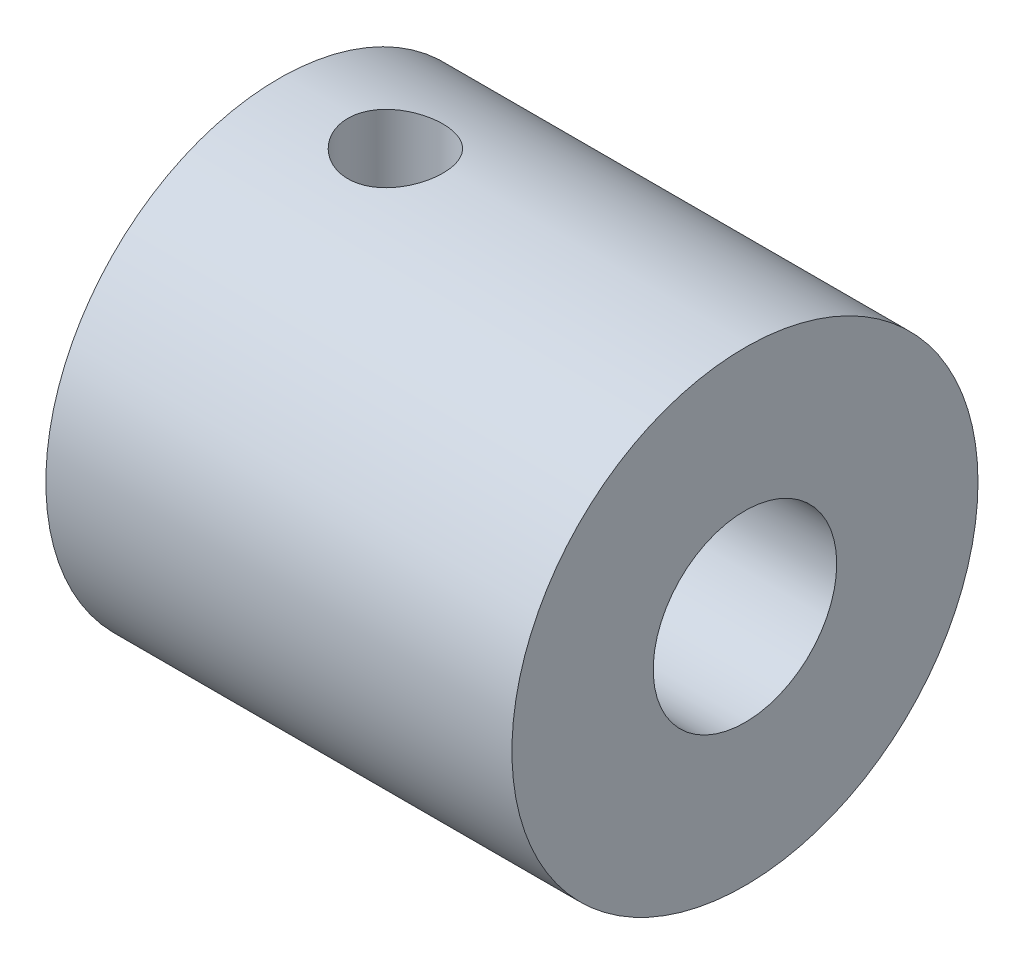
ISO-10303-21;
HEADER;
FILE_DESCRIPTION(('STEP AP214'),'2;1');
FILE_NAME('part.step','',(''),(''),'','','');
FILE_SCHEMA(('AUTOMOTIVE_DESIGN { 1 0 10303 214 1 1 1 1 }'));
ENDSEC;
DATA;
#1=APPLICATION_CONTEXT('core data for automotive mechanical design processes');
#2=APPLICATION_PROTOCOL_DEFINITION('international standard','automotive_design',2000,#1);
#3=PRODUCT_CONTEXT('',#1,'mechanical');
#4=PRODUCT('Part','Part','',(#3));
#5=PRODUCT_RELATED_PRODUCT_CATEGORY('part','',(#4));
#6=PRODUCT_DEFINITION_FORMATION('','',#4);
#7=PRODUCT_DEFINITION_CONTEXT('part definition',#1,'design');
#8=PRODUCT_DEFINITION('design','',#6,#7);
#9=PRODUCT_DEFINITION_SHAPE('','',#8);
#10=(LENGTH_UNIT() NAMED_UNIT(*) SI_UNIT(.MILLI.,.METRE.));
#11=(NAMED_UNIT(*) PLANE_ANGLE_UNIT() SI_UNIT($,.RADIAN.));
#12=(NAMED_UNIT(*) SI_UNIT($,.STERADIAN.) SOLID_ANGLE_UNIT());
#13=UNCERTAINTY_MEASURE_WITH_UNIT(LENGTH_MEASURE(1.E-05),#10,'distance_accuracy_value','');
#14=(GEOMETRIC_REPRESENTATION_CONTEXT(3) GLOBAL_UNCERTAINTY_ASSIGNED_CONTEXT((#13)) GLOBAL_UNIT_ASSIGNED_CONTEXT((#10,
#11,#12)) REPRESENTATION_CONTEXT('',''));
#15=CARTESIAN_POINT('',(0.,0.,0.));
#16=DIRECTION('',(0.,0.,1.));
#17=DIRECTION('',(1.,0.,0.));
#18=AXIS2_PLACEMENT_3D('',#15,#16,#17);
#19=CARTESIAN_POINT('',(25.4,0.,0.));
#20=DIRECTION('',(-1.,0.,0.));
#21=DIRECTION('',(0.,0.,1.));
#22=AXIS2_PLACEMENT_3D('',#19,#20,#21);
#23=CYLINDRICAL_SURFACE('',#22,12.7);
#24=CARTESIAN_POINT('',(6.35,12.4329302805091,-2.5908));
#25=CARTESIAN_POINT('',(6.49389236460437,12.4329331586559,-2.59079475206476));
#26=CARTESIAN_POINT('',(6.63785018657695,12.4354554548789,-2.57877165643568));
#27=CARTESIAN_POINT('',(6.92168894069004,12.4452565300148,-2.5310396013166));
#28=CARTESIAN_POINT('',(7.06156658598013,12.4525390387619,-2.49531206803491));
#29=CARTESIAN_POINT('',(7.33309763450372,12.4710022077238,-2.40132879766478));
#30=CARTESIAN_POINT('',(7.46475923410862,12.4821789073253,-2.34309594321986));
#31=CARTESIAN_POINT('',(7.7164416251351,12.5071664052162,-2.20581830696668));
#32=CARTESIAN_POINT('',(7.83646298050038,12.5209770757993,-2.12677453409063));
#33=CARTESIAN_POINT('',(8.06322853867538,12.5499033343607,-1.94887955710783));
#34=CARTESIAN_POINT('',(8.16977661170327,12.5650337385242,-1.8497807118404));
#35=CARTESIAN_POINT('',(8.36485772289805,12.5947643911458,-1.63512360250815));
#36=CARTESIAN_POINT('',(8.45338947070995,12.6093646015692,-1.51956416051877));
#37=CARTESIAN_POINT('',(8.61068896930447,12.6365499435243,-1.27396400187411));
#38=CARTESIAN_POINT('',(8.67926986862163,12.6491155642424,-1.14380126752145));
#39=CARTESIAN_POINT('',(8.79351454054484,12.6706492937657,-0.873500778455588));
#40=CARTESIAN_POINT('',(8.83918054581728,12.6796177530359,-0.733363997063294));
#41=CARTESIAN_POINT('',(8.90568728002511,12.6928419786629,-0.449129652825707));
#42=CARTESIAN_POINT('',(8.92685936115953,12.6971605909399,-0.305112594403049));
#43=CARTESIAN_POINT('',(8.94481150712322,12.7008157262987,-0.0155102229442602));
#44=CARTESIAN_POINT('',(8.94159401333011,12.7001527480339,0.130074931669876));
#45=CARTESIAN_POINT('',(8.91110872531533,12.6939679620428,0.416402456446831));
#46=CARTESIAN_POINT('',(8.88419789763865,12.6885182743276,0.557184617833286));
#47=CARTESIAN_POINT('',(8.80765658476037,12.6734539008924,0.832192000220411));
#48=CARTESIAN_POINT('',(8.75802516487838,12.6638390438264,0.96641695121893));
#49=CARTESIAN_POINT('',(8.63712392844266,12.6414063907364,1.22551243653904));
#50=CARTESIAN_POINT('',(8.56571520233611,12.6285681295098,1.35031630740349));
#51=CARTESIAN_POINT('',(8.40338933191286,12.6011023989231,1.58630165155927));
#52=CARTESIAN_POINT('',(8.31246985676619,12.5864747158816,1.69748149477602));
#53=CARTESIAN_POINT('',(8.11174809811108,12.556731492837,1.90518221754468));
#54=CARTESIAN_POINT('',(8.00163339509254,12.54161191595,2.00140083460716));
#55=CARTESIAN_POINT('',(7.76667754818959,12.5128398540798,2.17405680681798));
#56=CARTESIAN_POINT('',(7.64183610287928,12.4991873991367,2.25049375697428));
#57=CARTESIAN_POINT('',(7.38052524773624,12.4748868322041,2.38152701288511));
#58=CARTESIAN_POINT('',(7.24402976612544,12.4642456990596,2.43607270515696));
#59=CARTESIAN_POINT('',(6.96354359648775,12.4472737031887,2.52136626251295));
#60=CARTESIAN_POINT('',(6.81955393131466,12.4409422539013,2.55211736619052));
#61=CARTESIAN_POINT('',(6.53091088441091,12.4334244542394,2.58849357414497));
#62=CARTESIAN_POINT('',(6.3863148757644,12.4321485805013,2.59455591747866));
#63=CARTESIAN_POINT('',(6.09817784599266,12.43464584291,2.58256057467107));
#64=CARTESIAN_POINT('',(5.95463676296975,12.4384186804073,2.56450431523318));
#65=CARTESIAN_POINT('',(5.67416470057619,12.4505042803793,2.50516177399157));
#66=CARTESIAN_POINT('',(5.53718181638015,12.458771071105,2.46411059586375));
#67=CARTESIAN_POINT('',(5.27203823454614,12.4788725681389,2.36019554543222));
#68=CARTESIAN_POINT('',(5.14387828964475,12.4907075784105,2.29732981475838));
#69=CARTESIAN_POINT('',(4.89810967775142,12.516812213415,2.15058591121939));
#70=CARTESIAN_POINT('',(4.78066717615975,12.5311126037393,2.06643502329632));
#71=CARTESIAN_POINT('',(4.56141055033173,12.5604529798845,1.87987167613396));
#72=CARTESIAN_POINT('',(4.459598104964,12.5754930449274,1.77745725770746));
#73=CARTESIAN_POINT('',(4.27282578575489,12.6049096288386,1.55530789678407));
#74=CARTESIAN_POINT('',(4.18816205950293,12.6192716555193,1.43532173510689));
#75=CARTESIAN_POINT('',(4.04019457965645,12.6454590138183,1.18257517152241));
#76=CARTESIAN_POINT('',(3.9768899062416,12.6572844546659,1.04981532002623));
#77=CARTESIAN_POINT('',(3.87386522861892,12.6770045087558,0.77605531571143));
#78=CARTESIAN_POINT('',(3.83400797813737,12.6849219521002,0.635108531048626));
#79=CARTESIAN_POINT('',(3.77857587968012,12.6960320183174,0.348342310508435));
#80=CARTESIAN_POINT('',(3.76299798304247,12.6992252343901,0.202523488742439));
#81=CARTESIAN_POINT('',(3.75668880705995,12.7005122890902,-0.087022487766177));
#82=CARTESIAN_POINT('',(3.76551293553763,12.6986973745482,-0.230739733668234));
#83=CARTESIAN_POINT('',(3.80677302756448,12.6903646932965,-0.514597314800149));
#84=CARTESIAN_POINT('',(3.83920866924856,12.6838469906937,-0.654737698761763));
#85=CARTESIAN_POINT('',(3.9265701656045,12.6668445160098,-0.9271725892522));
#86=CARTESIAN_POINT('',(3.98144059284237,12.6563695256278,-1.05948551861761));
#87=CARTESIAN_POINT('',(4.11205685258133,12.6325784009629,-1.3130896172761));
#88=CARTESIAN_POINT('',(4.18780441538198,12.6192620312069,-1.43437987190008));
#89=CARTESIAN_POINT('',(4.35951416529044,12.5909696823876,-1.66468793400665));
#90=CARTESIAN_POINT('',(4.45579332650916,12.5759696662719,-1.77346648934467));
#91=CARTESIAN_POINT('',(4.6651843915652,12.5461405545301,-1.97347600639944));
#92=CARTESIAN_POINT('',(4.77830028860837,12.5313115003528,-2.06470279352506));
#93=CARTESIAN_POINT('',(5.0196873735854,12.5033184275654,-2.22800098046789));
#94=CARTESIAN_POINT('',(5.14811528771696,12.4901751039148,-2.29984441848912));
#95=CARTESIAN_POINT('',(5.415454454337,12.4672958331256,-2.4208170148411));
#96=CARTESIAN_POINT('',(5.5543561970746,12.4575568392416,-2.4699664961084));
#97=CARTESIAN_POINT('',(5.80294845884134,12.4445036225158,-2.5347801295761));
#98=CARTESIAN_POINT('',(5.91123464874171,12.4401909039478,-2.55574944663678));
#99=CARTESIAN_POINT('',(6.12966781120129,12.4344031836839,-2.5837611324713));
#100=CARTESIAN_POINT('',(6.23981471448387,12.4329280765741,-2.59080401859573));
#101=CARTESIAN_POINT('',(6.35,12.4329302805091,-2.5908));
#102=B_SPLINE_CURVE_WITH_KNOTS('',3,(#24,#25,#26,#27,#28,#29,#30,#31,#32,#33,#34,#35,#36,#37,
#38,#39,#40,#41,#42,#43,#44,#45,#46,#47,#48,#49,#50,#51,#52,#53,#54,#55,#56,#57,#58,#59,#60,#61,
#62,#63,#64,#65,#66,#67,#68,#69,#70,#71,#72,#73,#74,#75,#76,#77,#78,#79,#80,#81,#82,#83,#84,#85,
#86,#87,#88,#89,#90,#91,#92,#93,#94,#95,#96,#97,#98,#99,#100,#101),.UNSPECIFIED.,.T.,.F.,(4,2,2,
2,2,2,2,2,2,2,2,2,2,2,2,2,2,2,2,2,2,2,2,2,2,2,2,2,2,2,2,2,2,2,2,2,2,2,4),(0.,0.431273577648589,
0.862885482694361,1.29405968915448,1.72521299574582,2.16205644706968,2.59893117474345,
3.0397746719516,3.48057520812027,3.91534019937005,4.35006167155432,4.77834355252414,
5.20664305375052,5.63773378348117,6.068876041685,6.5078337788909,6.94680050221151,
7.38677636732841,7.8266923384191,8.25878257483537,8.69084725266866,9.11857300943069,
9.54633521287192,9.97988337701718,10.4134780772651,10.8540198313081,11.2945426111483,
11.7324605126208,12.1703234220519,12.6002615198939,13.0301937570583,13.4590701599702,
13.8879821189053,14.3240694025609,14.7602602792929,15.2013771765036,15.6420982740158,
15.9723574078522,16.3026042727184),.UNSPECIFIED.);
#103=CARTESIAN_POINT('',(6.35,12.4329302805091,-2.5908));
#104=VERTEX_POINT('',#103);
#105=EDGE_CURVE('E55',#104,#104,#102,.T.);
#106=ORIENTED_EDGE('',*,*,#105,.T.);
#107=EDGE_LOOP('',(#106));
#108=FACE_BOUND('',#107,.T.);
#109=CARTESIAN_POINT('',(25.4,0.,0.));
#110=DIRECTION('',(1.,0.,0.));
#111=DIRECTION('',(0.,0.,-1.));
#112=AXIS2_PLACEMENT_3D('',#109,#110,#111);
#113=CIRCLE('',#112,12.7);
#114=CARTESIAN_POINT('',(25.4,0.,-12.7));
#115=VERTEX_POINT('',#114);
#116=EDGE_CURVE('E10',#115,#115,#113,.T.);
#117=ORIENTED_EDGE('',*,*,#116,.F.);
#118=EDGE_LOOP('',(#117));
#119=FACE_BOUND('',#118,.T.);
#120=CARTESIAN_POINT('',(0.,0.,0.));
#121=DIRECTION('',(1.,0.,0.));
#122=DIRECTION('',(0.,0.,-1.));
#123=AXIS2_PLACEMENT_3D('',#120,#121,#122);
#124=CIRCLE('',#123,12.7);
#125=CARTESIAN_POINT('',(0.,0.,-12.7));
#126=VERTEX_POINT('',#125);
#127=EDGE_CURVE('E45',#126,#126,#124,.T.);
#128=ORIENTED_EDGE('',*,*,#127,.T.);
#129=EDGE_LOOP('',(#128));
#130=FACE_BOUND('',#129,.T.);
#131=ADVANCED_FACE('F33',(#108,#119,#130),#23,.T.);
#132=CARTESIAN_POINT('',(25.4,0.,0.));
#133=DIRECTION('',(1.,0.,0.));
#134=DIRECTION('',(0.,0.,-1.));
#135=AXIS2_PLACEMENT_3D('',#132,#133,#134);
#136=PLANE('',#135);
#137=CARTESIAN_POINT('',(25.4,0.,0.));
#138=DIRECTION('',(1.,0.,0.));
#139=DIRECTION('',(0.,0.,-1.));
#140=AXIS2_PLACEMENT_3D('',#137,#138,#139);
#141=CIRCLE('',#140,5.);
#142=CARTESIAN_POINT('',(25.4,0.,-5.));
#143=VERTEX_POINT('',#142);
#144=EDGE_CURVE('E62',#143,#143,#141,.T.);
#145=ORIENTED_EDGE('',*,*,#144,.F.);
#146=EDGE_LOOP('',(#145));
#147=FACE_BOUND('',#146,.T.);
#148=ORIENTED_EDGE('',*,*,#116,.T.);
#149=EDGE_LOOP('',(#148));
#150=FACE_BOUND('',#149,.T.);
#151=ADVANCED_FACE('F82',(#147,#150),#136,.T.);
#152=CARTESIAN_POINT('',(0.,0.,0.));
#153=DIRECTION('',(1.,0.,0.));
#154=DIRECTION('',(0.,0.,-1.));
#155=AXIS2_PLACEMENT_3D('',#152,#153,#154);
#156=PLANE('',#155);
#157=CARTESIAN_POINT('',(0.,0.,0.));
#158=DIRECTION('',(-1.,0.,0.));
#159=DIRECTION('',(0.,0.,1.));
#160=AXIS2_PLACEMENT_3D('',#157,#158,#159);
#161=CIRCLE('',#160,3.);
#162=CARTESIAN_POINT('',(0.,0.,3.));
#163=VERTEX_POINT('',#162);
#164=EDGE_CURVE('E52',#163,#163,#161,.T.);
#165=ORIENTED_EDGE('',*,*,#164,.F.);
#166=EDGE_LOOP('',(#165));
#167=FACE_BOUND('',#166,.T.);
#168=ORIENTED_EDGE('',*,*,#127,.F.);
#169=EDGE_LOOP('',(#168));
#170=FACE_BOUND('',#169,.T.);
#171=ADVANCED_FACE('F80',(#167,#170),#156,.F.);
#172=CARTESIAN_POINT('',(9.525,0.,0.));
#173=DIRECTION('',(-1.,0.,0.));
#174=DIRECTION('',(0.,0.,1.));
#175=AXIS2_PLACEMENT_3D('',#172,#173,#174);
#176=CYLINDRICAL_SURFACE('',#175,3.);
#177=CARTESIAN_POINT('',(6.35,1.51253276328151,-2.5908));
#178=CARTESIAN_POINT('',(6.26427492614181,1.51255612011091,-2.59079195845633));
#179=CARTESIAN_POINT('',(6.17846886227758,1.51998747037599,-2.58649046765555));
#180=CARTESIAN_POINT('',(6.00981265261651,1.54805371775819,-2.56977980264588));
#181=CARTESIAN_POINT('',(5.92697193490188,1.56872735389456,-2.55734683834809));
#182=CARTESIAN_POINT('',(5.73136409705994,1.63048816312793,-2.51859273502564));
#183=CARTESIAN_POINT('',(5.62094898725919,1.67652428062882,-2.48860613460027));
#184=CARTESIAN_POINT('',(5.40910270274055,1.7788698266139,-2.41651890831611));
#185=CARTESIAN_POINT('',(5.30770716645732,1.83521753302117,-2.3743727970288));
#186=CARTESIAN_POINT('',(5.13522255911951,1.93904322621695,-2.28987799806423));
#187=CARTESIAN_POINT('',(5.06248153998988,1.98562811515698,-2.24975049324172));
#188=CARTESIAN_POINT('',(4.9215656196084,2.07976501120837,-2.16302400149034));
#189=CARTESIAN_POINT('',(4.85339306197697,2.12731749863661,-2.11642173011328));
#190=CARTESIAN_POINT('',(4.72169468625243,2.22194657672806,-2.01684598477473));
#191=CARTESIAN_POINT('',(4.65816286674525,2.26902371166039,-1.96388098237663));
#192=CARTESIAN_POINT('',(4.53585683535935,2.36162627411132,-1.85149327342392));
#193=CARTESIAN_POINT('',(4.47708305423574,2.40715156092235,-1.79206998332533));
#194=CARTESIAN_POINT('',(4.3338927348678,2.51983139601371,-1.63234201230524));
#195=CARTESIAN_POINT('',(4.25304811559809,2.58518619901239,-1.52746322490132));
#196=CARTESIAN_POINT('',(4.10637883920486,2.70552223709374,-1.3024492100517));
#197=CARTESIAN_POINT('',(4.04052912403739,2.76052075158463,-1.18233996519486));
#198=CARTESIAN_POINT('',(3.93762747082766,2.84722329086607,-0.9516291464055));
#199=CARTESIAN_POINT('',(3.8975096804226,2.88134910286853,-0.843318111253381));
#200=CARTESIAN_POINT('',(3.83163601595831,2.93762107655023,-0.619414292985377));
#201=CARTESIAN_POINT('',(3.80587163127161,2.95977433693317,-0.503825870236281));
#202=CARTESIAN_POINT('',(3.77030450694132,2.99040149200148,-0.267800867316888));
#203=CARTESIAN_POINT('',(3.76058081712969,2.99880763805496,-0.147343256254082));
#204=CARTESIAN_POINT('',(3.7580950504805,3.00095412430332,0.0938755340326515));
#205=CARTESIAN_POINT('',(3.76533064272595,2.99469647991834,0.214636669260811));
#206=CARTESIAN_POINT('',(3.7949455041088,2.96917658112436,0.442862256712421));
#207=CARTESIAN_POINT('',(3.81606839245698,2.95099352341404,0.550618096680923));
#208=CARTESIAN_POINT('',(3.87092920410049,2.90402266248371,0.760406489883583));
#209=CARTESIAN_POINT('',(3.90466926654391,2.8752330610153,0.862438069236536));
#210=CARTESIAN_POINT('',(3.98605194982561,2.8063319487547,1.06626033475644));
#211=CARTESIAN_POINT('',(4.03453350270392,2.76554430869948,1.16748319435821));
#212=CARTESIAN_POINT('',(4.14221357634785,2.67603987617784,1.36019589971729));
#213=CARTESIAN_POINT('',(4.20141935348339,2.62731771721664,1.45167908832891));
#214=CARTESIAN_POINT('',(4.36137662966442,2.49782324991965,1.66849967244504));
#215=CARTESIAN_POINT('',(4.46794629004554,2.41335057689111,1.78740051009546));
#216=CARTESIAN_POINT('',(4.6404912418811,2.2822770868739,1.94834328629335));
#217=CARTESIAN_POINT('',(4.70023649923485,2.23777717070501,1.99916271620574));
#218=CARTESIAN_POINT('',(4.82382680788622,2.14829114981168,2.09502886322842));
#219=CARTESIAN_POINT('',(4.88767066376937,2.10330519000388,2.14007725216521));
#220=CARTESIAN_POINT('',(5.0608402439045,1.98578989635153,2.25090607555625));
#221=CARTESIAN_POINT('',(5.17357954697895,1.91368006069122,2.31197083361736));
#222=CARTESIAN_POINT('',(5.35140197369434,1.81180762569263,2.39149116353857));
#223=CARTESIAN_POINT('',(5.41206515173293,1.77892779224293,2.4159671873474));
#224=CARTESIAN_POINT('',(5.53658021897958,1.71653562491763,2.46068489384182));
#225=CARTESIAN_POINT('',(5.60042974019561,1.68702084228227,2.48092966468046));
#226=CARTESIAN_POINT('',(5.74146146424431,1.6289104521286,2.51953269545319));
#227=CARTESIAN_POINT('',(5.81919916125312,1.60112975166653,2.5371419325986));
#228=CARTESIAN_POINT('',(5.9787033879458,1.5555775593804,2.56532794844355));
#229=CARTESIAN_POINT('',(6.06045894922063,1.53778030277002,2.57592284228842));
#230=CARTESIAN_POINT('',(6.22745007332612,1.51522489661733,2.58926445243541));
#231=CARTESIAN_POINT('',(6.31271435265532,1.51061498413831,2.59192196023664));
#232=CARTESIAN_POINT('',(6.48264295645887,1.51595310995128,2.58880053396774));
#233=CARTESIAN_POINT('',(6.56730684993475,1.52591071529531,2.58301605572509));
#234=CARTESIAN_POINT('',(6.74654250990025,1.56077787969145,2.56211326660133));
#235=CARTESIAN_POINT('',(6.84051331231949,1.58783764672856,2.5456414773508));
#236=CARTESIAN_POINT('',(7.0225119625732,1.65309565935416,2.50374969096157));
#237=CARTESIAN_POINT('',(7.11051663807068,1.69133457701327,2.47829694800858));
#238=CARTESIAN_POINT('',(7.2678108181809,1.76809808099678,2.42398612005682));
#239=CARTESIAN_POINT('',(7.33793116982743,1.80572508762934,2.39620621833917));
#240=CARTESIAN_POINT('',(7.47425742461911,1.88376838836308,2.33535144401441));
#241=CARTESIAN_POINT('',(7.54046064734492,1.92418655233662,2.30227300180528));
#242=CARTESIAN_POINT('',(7.66923888962978,2.0064130474544,2.23098044311056));
#243=CARTESIAN_POINT('',(7.73180990774144,2.04822283482821,2.19276081093333));
#244=CARTESIAN_POINT('',(7.85339168874127,2.13213716118065,2.11125943882894));
#245=CARTESIAN_POINT('',(7.9124011045037,2.17424180504754,2.06797580147758));
#246=CARTESIAN_POINT('',(8.03020240384195,2.26033750716367,1.97362281341468));
#247=CARTESIAN_POINT('',(8.08877457648702,2.30429266822702,1.92224423233824));
#248=CARTESIAN_POINT('',(8.20162535856829,2.39059744065634,1.81379737165328));
#249=CARTESIAN_POINT('',(8.25590386987681,2.43294701531659,1.75672896207631));
#250=CARTESIAN_POINT('',(8.41153573769208,2.55609775961075,1.57712542700478));
#251=CARTESIAN_POINT('',(8.50611632932879,2.63332500246479,1.44585158939612));
#252=CARTESIAN_POINT('',(8.64777219522872,2.75071982813145,1.20256702906592));
#253=CARTESIAN_POINT('',(8.70067480675802,2.79514519492128,1.09597098612125));
#254=CARTESIAN_POINT('',(8.79229001030394,2.87261743131275,0.872903532867843));
#255=CARTESIAN_POINT('',(8.83101200951039,2.90567184333666,0.756438732718466));
#256=CARTESIAN_POINT('',(8.89210976284714,2.95801076866704,0.515263606272398));
#257=CARTESIAN_POINT('',(8.91436065017822,2.97719007101465,0.390497954416404));
#258=CARTESIAN_POINT('',(8.94025339667807,2.99952034668281,0.137642777613278));
#259=CARTESIAN_POINT('',(8.94390686035288,3.00268131519154,0.00955537555651819));
#260=CARTESIAN_POINT('',(8.93301267637785,2.99327700313147,-0.230221877065449));
#261=CARTESIAN_POINT('',(8.92053156980946,2.98249721175367,-0.342086934819483));
#262=CARTESIAN_POINT('',(8.88167185997391,2.94907098554707,-0.561516253690383));
#263=CARTESIAN_POINT('',(8.85529140639986,2.92642297080049,-0.669079940149087));
#264=CARTESIAN_POINT('',(8.78956122879307,2.87035104016713,-0.879278837202367));
#265=CARTESIAN_POINT('',(8.74999780182005,2.83674977532428,-0.981798573173208));
#266=CARTESIAN_POINT('',(8.65984563614208,2.76089675247996,-1.17837580978644));
#267=CARTESIAN_POINT('',(8.60925258586615,2.71864161199932,-1.27242998079813));
#268=CARTESIAN_POINT('',(8.47261845299026,2.60597908117331,-1.49355061048651));
#269=CARTESIAN_POINT('',(8.38111192446364,2.53169254768085,-1.61526912504953));
#270=CARTESIAN_POINT('',(8.18163706517466,2.37461469652504,-1.83844618045427));
#271=CARTESIAN_POINT('',(8.07361963325837,2.29179825998703,-1.93984213423929));
#272=CARTESIAN_POINT('',(7.89972223697809,2.16513343312634,-2.07754760548003));
#273=CARTESIAN_POINT('',(7.83910507803915,2.1220584930967,-2.12141765546268));
#274=CARTESIAN_POINT('',(7.71407803506608,2.03626752955406,-2.20389443585572));
#275=CARTESIAN_POINT('',(7.64966678602539,1.99355164161185,-2.24249925521872));
#276=CARTESIAN_POINT('',(7.51707742919277,1.90976085793694,-2.31427060411438));
#277=CARTESIAN_POINT('',(7.44890715087732,1.86868283716649,-2.34744790583717));
#278=CARTESIAN_POINT('',(7.30842685796318,1.789683555195,-2.40821769888648));
#279=CARTESIAN_POINT('',(7.2361205807456,1.75175951772638,-2.43581513314125));
#280=CARTESIAN_POINT('',(7.08158975964539,1.678689964546,-2.48678832410906));
#281=CARTESIAN_POINT('',(6.99902578650134,1.64393848289596,-2.50971965974072));
#282=CARTESIAN_POINT('',(6.82872871302323,1.58450558017359,-2.54766590872646));
#283=CARTESIAN_POINT('',(6.74101641984938,1.55978644162495,-2.56271053629402));
#284=CARTESIAN_POINT('',(6.60197419271894,1.53260950916767,-2.57899861159965));
#285=CARTESIAN_POINT('',(6.5519833918685,1.52513978757592,-2.58340572109801));
#286=CARTESIAN_POINT('',(6.45133781207387,1.51509461273053,-2.58930873140108));
#287=CARTESIAN_POINT('',(6.40068306108582,1.51251895407077,-2.59080475438551));
#288=CARTESIAN_POINT('',(6.35,1.51253276328151,-2.5908));
#289=B_SPLINE_CURVE_WITH_KNOTS('',3,(#177,#178,#179,#180,#181,#182,#183,#184,#185,#186,#187,
#188,#189,#190,#191,#192,#193,#194,#195,#196,#197,#198,#199,#200,#201,#202,#203,#204,#205,#206,
#207,#208,#209,#210,#211,#212,#213,#214,#215,#216,#217,#218,#219,#220,#221,#222,#223,#224,#225,
#226,#227,#228,#229,#230,#231,#232,#233,#234,#235,#236,#237,#238,#239,#240,#241,#242,#243,#244,
#245,#246,#247,#248,#249,#250,#251,#252,#253,#254,#255,#256,#257,#258,#259,#260,#261,#262,#263,
#264,#265,#266,#267,#268,#269,#270,#271,#272,#273,#274,#275,#276,#277,#278,#279,#280,#281,#282,
#283,#284,#285,#286,#287,#288),.UNSPECIFIED.,.T.,.F.,(4,2,2,2,2,2,2,2,2,2,2,2,2,2,2,2,2,2,2,2,2,
2,2,2,2,2,2,2,2,2,2,2,2,2,2,2,2,2,2,2,2,2,2,2,2,2,2,2,2,2,2,2,2,2,2,4),(0.,0.256946652543902,
0.514648431956513,0.882554810824417,1.25185567875423,1.53725936639997,1.82280836269465,
2.10798129718482,2.39318002016974,2.83447729756666,3.27503161912142,3.63486095511413,
3.99447670823103,4.35585943940178,4.71719250433376,5.04965042628318,5.38216473957638,
5.73909529681132,6.09626827358916,6.63504203038683,6.90537230605723,7.17562409116305,
7.61536032472755,7.83480208022823,8.05408311393334,8.30654565544826,8.55835362055553,
8.81298120854802,9.06777609540659,9.36361583639994,9.6605455907338,9.91307870056471,
10.1657826619054,10.4187599300572,10.6718322912763,10.9398874589454,11.207948751,
11.7421808422273,12.1218539164677,12.5012746634903,12.8835431248806,13.2655730273714,
13.6031911825255,13.9408542933959,14.2842814355376,14.6278430676832,15.1334177209708,
15.640526236197,15.8993492449512,16.1582659465012,16.4166623629542,16.6748288661374,
16.9515012177834,17.2271235389417,17.379043962108,17.5309580089623),.UNSPECIFIED.);
#290=CARTESIAN_POINT('',(6.35,1.51253276328151,-2.5908));
#291=VERTEX_POINT('',#290);
#292=EDGE_CURVE('E37',#291,#291,#289,.T.);
#293=ORIENTED_EDGE('',*,*,#292,.T.);
#294=EDGE_LOOP('',(#293));
#295=FACE_BOUND('',#294,.T.);
#296=CARTESIAN_POINT('',(9.525,0.,0.));
#297=DIRECTION('',(-1.,0.,0.));
#298=DIRECTION('',(0.,0.,1.));
#299=AXIS2_PLACEMENT_3D('',#296,#297,#298);
#300=CIRCLE('',#299,3.);
#301=CARTESIAN_POINT('',(9.525,0.,3.));
#302=VERTEX_POINT('',#301);
#303=EDGE_CURVE('E50',#302,#302,#300,.T.);
#304=ORIENTED_EDGE('',*,*,#303,.F.);
#305=EDGE_LOOP('',(#304));
#306=FACE_BOUND('',#305,.T.);
#307=ORIENTED_EDGE('',*,*,#164,.T.);
#308=EDGE_LOOP('',(#307));
#309=FACE_BOUND('',#308,.T.);
#310=ADVANCED_FACE('F75',(#295,#306,#309),#176,.F.);
#311=CARTESIAN_POINT('',(9.525,0.,0.));
#312=DIRECTION('',(-1.,0.,0.));
#313=DIRECTION('',(0.,0.,1.));
#314=AXIS2_PLACEMENT_3D('',#311,#312,#313);
#315=PLANE('',#314);
#316=ORIENTED_EDGE('',*,*,#303,.T.);
#317=EDGE_LOOP('',(#316));
#318=FACE_BOUND('',#317,.T.);
#319=ADVANCED_FACE('F70',(#318),#315,.T.);
#320=CARTESIAN_POINT('',(6.35,0.,0.));
#321=DIRECTION('',(0.,-1.,0.));
#322=DIRECTION('',(0.,0.,-1.));
#323=AXIS2_PLACEMENT_3D('',#320,#321,#322);
#324=CYLINDRICAL_SURFACE('',#323,2.5908);
#325=ORIENTED_EDGE('',*,*,#292,.F.);
#326=EDGE_LOOP('',(#325));
#327=FACE_BOUND('',#326,.T.);
#328=ORIENTED_EDGE('',*,*,#105,.F.);
#329=EDGE_LOOP('',(#328));
#330=FACE_BOUND('',#329,.T.);
#331=ADVANCED_FACE('F64',(#327,#330),#324,.F.);
#332=CARTESIAN_POINT('',(15.875,0.,0.));
#333=DIRECTION('',(1.,0.,0.));
#334=DIRECTION('',(0.,0.,-1.));
#335=AXIS2_PLACEMENT_3D('',#332,#333,#334);
#336=CYLINDRICAL_SURFACE('',#335,5.);
#337=CARTESIAN_POINT('',(15.875,0.,0.));
#338=DIRECTION('',(1.,0.,0.));
#339=DIRECTION('',(0.,0.,-1.));
#340=AXIS2_PLACEMENT_3D('',#337,#338,#339);
#341=CIRCLE('',#340,5.);
#342=CARTESIAN_POINT('',(15.875,0.,-5.));
#343=VERTEX_POINT('',#342);
#344=EDGE_CURVE('E133',#343,#343,#341,.T.);
#345=CARTESIAN_POINT('',(15.875,0.,-5.));
#346=CARTESIAN_POINT('',(15.97421875,0.,-5.));
#347=CARTESIAN_POINT('',(16.0734375,0.,-5.));
#348=CARTESIAN_POINT('',(16.271875,0.,-5.));
#349=CARTESIAN_POINT('',(16.37109375,0.,-5.));
#350=CARTESIAN_POINT('',(16.56953125,0.,-5.));
#351=CARTESIAN_POINT('',(16.66875,0.,-5.));
#352=CARTESIAN_POINT('',(16.8671875,0.,-5.));
#353=CARTESIAN_POINT('',(16.96640625,0.,-5.));
#354=CARTESIAN_POINT('',(17.16484375,0.,-5.));
#355=CARTESIAN_POINT('',(17.2640625,0.,-5.));
#356=CARTESIAN_POINT('',(17.4625,0.,-5.));
#357=CARTESIAN_POINT('',(17.56171875,0.,-5.));
#358=CARTESIAN_POINT('',(17.76015625,0.,-5.));
#359=CARTESIAN_POINT('',(17.859375,0.,-5.));
#360=CARTESIAN_POINT('',(18.0578125,0.,-5.));
#361=CARTESIAN_POINT('',(18.15703125,0.,-5.));
#362=CARTESIAN_POINT('',(18.35546875,0.,-5.));
#363=CARTESIAN_POINT('',(18.4546875,0.,-5.));
#364=CARTESIAN_POINT('',(18.653125,0.,-5.));
#365=CARTESIAN_POINT('',(18.75234375,0.,-5.));
#366=CARTESIAN_POINT('',(18.95078125,0.,-5.));
#367=CARTESIAN_POINT('',(19.05,0.,-5.));
#368=CARTESIAN_POINT('',(19.2484375,0.,-5.));
#369=CARTESIAN_POINT('',(19.34765625,0.,-5.));
#370=CARTESIAN_POINT('',(19.54609375,0.,-5.));
#371=CARTESIAN_POINT('',(19.6453125,0.,-5.));
#372=CARTESIAN_POINT('',(19.84375,0.,-5.));
#373=CARTESIAN_POINT('',(19.94296875,0.,-5.));
#374=CARTESIAN_POINT('',(20.14140625,0.,-5.));
#375=CARTESIAN_POINT('',(20.240625,0.,-5.));
#376=CARTESIAN_POINT('',(20.4390625,0.,-5.));
#377=CARTESIAN_POINT('',(20.53828125,0.,-5.));
#378=CARTESIAN_POINT('',(20.73671875,0.,-5.));
#379=CARTESIAN_POINT('',(20.8359375,0.,-5.));
#380=CARTESIAN_POINT('',(21.034375,0.,-5.));
#381=CARTESIAN_POINT('',(21.13359375,0.,-5.));
#382=CARTESIAN_POINT('',(21.33203125,0.,-5.));
#383=CARTESIAN_POINT('',(21.43125,0.,-5.));
#384=CARTESIAN_POINT('',(21.6296875,0.,-5.));
#385=CARTESIAN_POINT('',(21.72890625,0.,-5.));
#386=CARTESIAN_POINT('',(21.92734375,0.,-5.));
#387=CARTESIAN_POINT('',(22.0265625,0.,-5.));
#388=CARTESIAN_POINT('',(22.225,0.,-5.));
#389=CARTESIAN_POINT('',(22.32421875,0.,-5.));
#390=CARTESIAN_POINT('',(22.52265625,0.,-5.));
#391=CARTESIAN_POINT('',(22.621875,0.,-5.));
#392=CARTESIAN_POINT('',(22.8203125,0.,-5.));
#393=CARTESIAN_POINT('',(22.91953125,0.,-5.));
#394=CARTESIAN_POINT('',(23.11796875,0.,-5.));
#395=CARTESIAN_POINT('',(23.2171875,0.,-5.));
#396=CARTESIAN_POINT('',(23.415625,0.,-5.));
#397=CARTESIAN_POINT('',(23.51484375,0.,-5.));
#398=CARTESIAN_POINT('',(23.71328125,0.,-5.));
#399=CARTESIAN_POINT('',(23.8125,0.,-5.));
#400=CARTESIAN_POINT('',(24.0109375,0.,-5.));
#401=CARTESIAN_POINT('',(24.11015625,0.,-5.));
#402=CARTESIAN_POINT('',(24.30859375,0.,-5.));
#403=CARTESIAN_POINT('',(24.4078125,0.,-5.));
#404=CARTESIAN_POINT('',(24.60625,0.,-5.));
#405=CARTESIAN_POINT('',(24.70546875,0.,-5.));
#406=CARTESIAN_POINT('',(24.90390625,0.,-5.));
#407=CARTESIAN_POINT('',(25.003125,0.,-5.));
#408=CARTESIAN_POINT('',(25.2015625,0.,-5.));
#409=CARTESIAN_POINT('',(25.30078125,0.,-5.));
#410=CARTESIAN_POINT('',(25.4,0.,-5.));
#411=B_SPLINE_CURVE_WITH_KNOTS('',3,(#345,#346,#347,#348,#349,#350,#351,#352,#353,#354,#355,
#356,#357,#358,#359,#360,#361,#362,#363,#364,#365,#366,#367,#368,#369,#370,#371,#372,#373,#374,
#375,#376,#377,#378,#379,#380,#381,#382,#383,#384,#385,#386,#387,#388,#389,#390,#391,#392,#393,
#394,#395,#396,#397,#398,#399,#400,#401,#402,#403,#404,#405,#406,#407,#408,#409,#410),
.UNSPECIFIED.,.F.,.F.,(4,2,2,2,2,2,2,2,2,2,2,2,2,2,2,2,2,2,2,2,2,2,2,2,2,2,2,2,2,2,2,2,4),(0.,
0.29765625,0.5953125,0.892968750000001,1.190625,1.48828125,1.7859375,2.08359375,2.38125,
2.67890625,2.9765625,3.27421875,3.571875,3.86953125,4.1671875,4.46484375,4.7625,5.06015625,
5.3578125,5.65546875,5.953125,6.25078125,6.5484375,6.84609375,7.14375,7.44140625,7.7390625,
8.03671875,8.334375,8.63203125,8.9296875,9.22734375,9.525),.UNSPECIFIED.);
#412=EDGE_CURVE('BSEAM69',#343,#143,#411,.T.);
#413=ORIENTED_EDGE('',*,*,#344,.F.);
#414=ORIENTED_EDGE('',*,*,#144,.T.);
#415=ORIENTED_EDGE('',*,*,#412,.T.);
#416=ORIENTED_EDGE('',*,*,#412,.F.);
#417=EDGE_LOOP('',(#413,#415,#414,#416));
#418=FACE_BOUND('',#417,.T.);
#419=ADVANCED_FACE('F69',(#418),#336,.F.);
#420=CARTESIAN_POINT('',(15.875,0.,0.));
#421=DIRECTION('',(1.,0.,0.));
#422=DIRECTION('',(0.,0.,-1.));
#423=AXIS2_PLACEMENT_3D('',#420,#421,#422);
#424=PLANE('',#423);
#425=ORIENTED_EDGE('',*,*,#344,.T.);
#426=EDGE_LOOP('',(#425));
#427=FACE_BOUND('',#426,.T.);
#428=ADVANCED_FACE('F119',(#427),#424,.T.);
#429=CLOSED_SHELL('',(#131,#151,#171,#310,#319,#331,#419,#428));
#430=MANIFOLD_SOLID_BREP('B2',#429);
#431=ADVANCED_BREP_SHAPE_REPRESENTATION('',(#18,#430),#14);
#432=SHAPE_DEFINITION_REPRESENTATION(#9,#431);
ENDSEC;
END-ISO-10303-21;
